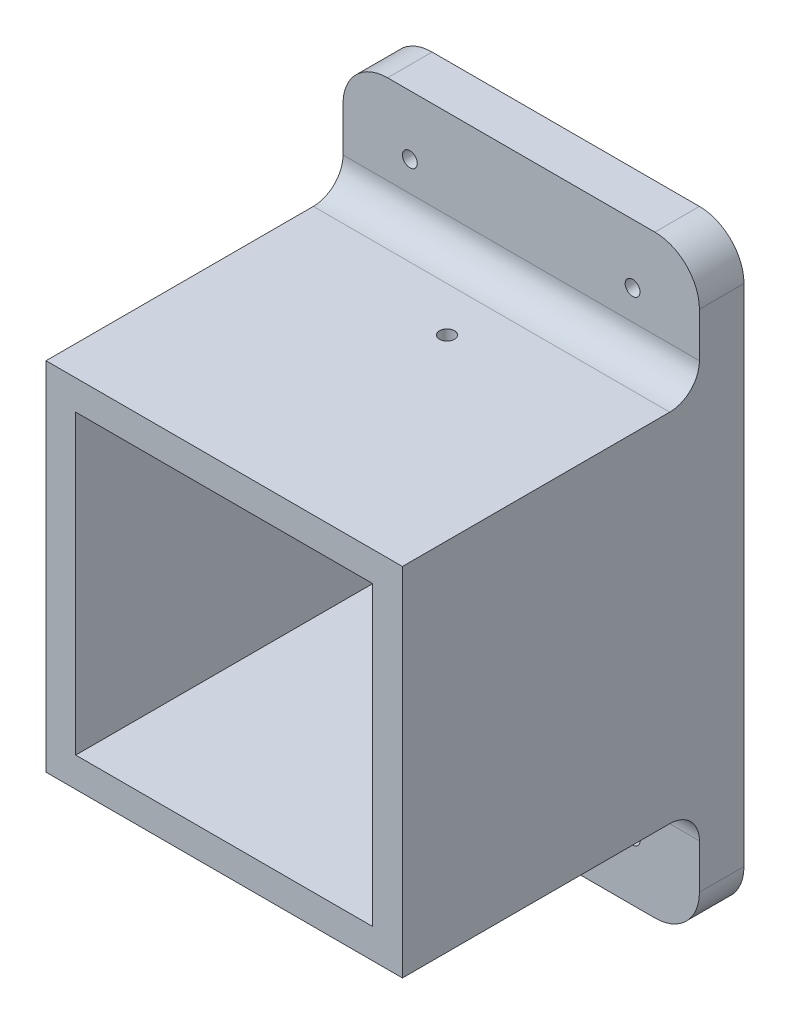
ISO-10303-21;
HEADER;
FILE_DESCRIPTION(('STEP AP214'),'2;1');
FILE_NAME('part.step','',(''),(''),'','','');
FILE_SCHEMA(('AUTOMOTIVE_DESIGN { 1 0 10303 214 1 1 1 1 }'));
ENDSEC;
DATA;
#1=APPLICATION_CONTEXT('core data for automotive mechanical design processes');
#2=APPLICATION_PROTOCOL_DEFINITION('international standard','automotive_design',2000,#1);
#3=PRODUCT_CONTEXT('',#1,'mechanical');
#4=PRODUCT('Part','Part','',(#3));
#5=PRODUCT_RELATED_PRODUCT_CATEGORY('part','',(#4));
#6=PRODUCT_DEFINITION_FORMATION('','',#4);
#7=PRODUCT_DEFINITION_CONTEXT('part definition',#1,'design');
#8=PRODUCT_DEFINITION('design','',#6,#7);
#9=PRODUCT_DEFINITION_SHAPE('','',#8);
#10=(LENGTH_UNIT() NAMED_UNIT(*) SI_UNIT(.MILLI.,.METRE.));
#11=(NAMED_UNIT(*) PLANE_ANGLE_UNIT() SI_UNIT($,.RADIAN.));
#12=(NAMED_UNIT(*) SI_UNIT($,.STERADIAN.) SOLID_ANGLE_UNIT());
#13=UNCERTAINTY_MEASURE_WITH_UNIT(LENGTH_MEASURE(1.E-05),#10,'distance_accuracy_value','');
#14=(GEOMETRIC_REPRESENTATION_CONTEXT(3) GLOBAL_UNCERTAINTY_ASSIGNED_CONTEXT((#13)) GLOBAL_UNIT_ASSIGNED_CONTEXT((#10,
#11,#12)) REPRESENTATION_CONTEXT('',''));
#15=CARTESIAN_POINT('',(0.,0.,0.));
#16=DIRECTION('',(0.,0.,1.));
#17=DIRECTION('',(1.,0.,0.));
#18=AXIS2_PLACEMENT_3D('',#15,#16,#17);
#19=CARTESIAN_POINT('',(0.,0.,100.));
#20=DIRECTION('',(0.,0.,1.));
#21=DIRECTION('',(1.,0.,0.));
#22=AXIS2_PLACEMENT_3D('',#19,#20,#21);
#23=PLANE('',#22);
#24=DIRECTION('',(1.,0.,0.));
#25=VECTOR('',#24,1.);
#26=CARTESIAN_POINT('',(-60.,-60.,100.));
#27=LINE('',#26,#25);
#28=CARTESIAN_POINT('',(-60.,-60.,100.));
#29=VERTEX_POINT('',#28);
#30=CARTESIAN_POINT('',(60.,-60.,100.));
#31=VERTEX_POINT('',#30);
#32=EDGE_CURVE('E202',#29,#31,#27,.T.);
#33=ORIENTED_EDGE('',*,*,#32,.T.);
#34=DIRECTION('',(0.,1.,0.));
#35=VECTOR('',#34,1.);
#36=CARTESIAN_POINT('',(60.,-60.,100.));
#37=LINE('',#36,#35);
#38=CARTESIAN_POINT('',(60.,60.,100.));
#39=VERTEX_POINT('',#38);
#40=EDGE_CURVE('E207',#31,#39,#37,.T.);
#41=ORIENTED_EDGE('',*,*,#40,.T.);
#42=DIRECTION('',(-1.,0.,0.));
#43=VECTOR('',#42,1.);
#44=CARTESIAN_POINT('',(-60.,60.,100.));
#45=LINE('',#44,#43);
#46=CARTESIAN_POINT('',(-60.,60.,100.));
#47=VERTEX_POINT('',#46);
#48=EDGE_CURVE('E206',#39,#47,#45,.T.);
#49=ORIENTED_EDGE('',*,*,#48,.T.);
#50=DIRECTION('',(0.,-1.,0.));
#51=VECTOR('',#50,1.);
#52=CARTESIAN_POINT('',(-60.,-60.,100.));
#53=LINE('',#52,#51);
#54=EDGE_CURVE('E208',#47,#29,#53,.T.);
#55=ORIENTED_EDGE('',*,*,#54,.T.);
#56=EDGE_LOOP('',(#33,#41,#49,#55));
#57=FACE_BOUND('',#56,.T.);
#58=DIRECTION('',(0.,1.,0.));
#59=VECTOR('',#58,1.);
#60=CARTESIAN_POINT('',(50.,-50.,100.));
#61=LINE('',#60,#59);
#62=CARTESIAN_POINT('',(50.,-50.,100.));
#63=VERTEX_POINT('',#62);
#64=CARTESIAN_POINT('',(50.,50.,100.));
#65=VERTEX_POINT('',#64);
#66=EDGE_CURVE('E193',#63,#65,#61,.T.);
#67=ORIENTED_EDGE('',*,*,#66,.F.);
#68=DIRECTION('',(1.,0.,0.));
#69=VECTOR('',#68,1.);
#70=CARTESIAN_POINT('',(-50.,-50.,100.));
#71=LINE('',#70,#69);
#72=CARTESIAN_POINT('',(-50.,-50.,100.));
#73=VERTEX_POINT('',#72);
#74=EDGE_CURVE('E191',#73,#63,#71,.T.);
#75=ORIENTED_EDGE('',*,*,#74,.F.);
#76=DIRECTION('',(0.,-1.,0.));
#77=VECTOR('',#76,1.);
#78=CARTESIAN_POINT('',(-50.,-50.,100.));
#79=LINE('',#78,#77);
#80=CARTESIAN_POINT('',(-50.,50.,100.));
#81=VERTEX_POINT('',#80);
#82=EDGE_CURVE('E173',#81,#73,#79,.T.);
#83=ORIENTED_EDGE('',*,*,#82,.F.);
#84=DIRECTION('',(-1.,0.,0.));
#85=VECTOR('',#84,1.);
#86=CARTESIAN_POINT('',(-50.,50.,100.));
#87=LINE('',#86,#85);
#88=EDGE_CURVE('E334',#65,#81,#87,.T.);
#89=ORIENTED_EDGE('',*,*,#88,.F.);
#90=EDGE_LOOP('',(#67,#75,#83,#89));
#91=FACE_BOUND('',#90,.T.);
#92=ADVANCED_FACE('F41',(#57,#91),#23,.T.);
#93=CARTESIAN_POINT('',(-60.,-60.,100.));
#94=DIRECTION('',(0.,1.,0.));
#95=DIRECTION('',(0.,0.,1.));
#96=AXIS2_PLACEMENT_3D('',#93,#94,#95);
#97=PLANE('',#96);
#98=CARTESIAN_POINT('',(0.,-60.,25.));
#99=DIRECTION('',(0.,1.,0.));
#100=DIRECTION('',(0.,0.,1.));
#101=AXIS2_PLACEMENT_3D('',#98,#99,#100);
#102=CIRCLE('',#101,2.49999999999997);
#103=CARTESIAN_POINT('',(0.,-60.,27.5));
#104=VERTEX_POINT('',#103);
#105=EDGE_CURVE('E451',#104,#104,#102,.T.);
#106=ORIENTED_EDGE('',*,*,#105,.T.);
#107=EDGE_LOOP('',(#106));
#108=FACE_BOUND('',#107,.T.);
#109=DIRECTION('',(0.,0.,-1.));
#110=VECTOR('',#109,1.);
#111=CARTESIAN_POINT('',(-60.,-60.,100.));
#112=LINE('',#111,#110);
#113=CARTESIAN_POINT('',(-60.,-60.,9.99999999999999));
#114=VERTEX_POINT('',#113);
#115=EDGE_CURVE('E211',#29,#114,#112,.T.);
#116=ORIENTED_EDGE('',*,*,#115,.T.);
#117=DIRECTION('',(1.,0.,0.));
#118=VECTOR('',#117,1.);
#119=CARTESIAN_POINT('',(60.,-60.,9.99999999999999));
#120=LINE('',#119,#118);
#121=CARTESIAN_POINT('',(60.,-60.,9.99999999999999));
#122=VERTEX_POINT('',#121);
#123=EDGE_CURVE('E286',#114,#122,#120,.T.);
#124=ORIENTED_EDGE('',*,*,#123,.T.);
#125=DIRECTION('',(0.,0.,-1.));
#126=VECTOR('',#125,1.);
#127=CARTESIAN_POINT('',(60.,-60.,100.));
#128=LINE('',#127,#126);
#129=EDGE_CURVE('E223',#31,#122,#128,.T.);
#130=ORIENTED_EDGE('',*,*,#129,.F.);
#131=ORIENTED_EDGE('',*,*,#32,.F.);
#132=EDGE_LOOP('',(#116,#124,#130,#131));
#133=FACE_BOUND('',#132,.T.);
#134=ADVANCED_FACE('F343',(#108,#133),#97,.F.);
#135=CARTESIAN_POINT('',(60.,-60.,100.));
#136=DIRECTION('',(-1.,0.,0.));
#137=DIRECTION('',(0.,-1.,0.));
#138=AXIS2_PLACEMENT_3D('',#135,#136,#137);
#139=PLANE('',#138);
#140=DIRECTION('',(0.,1.,0.));
#141=VECTOR('',#140,1.);
#142=CARTESIAN_POINT('',(60.,0.,0.));
#143=LINE('',#142,#141);
#144=CARTESIAN_POINT('',(60.,-85.,0.));
#145=VERTEX_POINT('',#144);
#146=CARTESIAN_POINT('',(60.,-70.,0.));
#147=VERTEX_POINT('',#146);
#148=EDGE_CURVE('E330',#145,#147,#143,.T.);
#149=ORIENTED_EDGE('',*,*,#148,.F.);
#150=DIRECTION('',(0.,0.,1.));
#151=VECTOR('',#150,1.);
#152=CARTESIAN_POINT('',(60.,-85.,100.));
#153=LINE('',#152,#151);
#154=CARTESIAN_POINT('',(60.,-85.,-15.));
#155=VERTEX_POINT('',#154);
#156=EDGE_CURVE('E271',#145,#155,#153,.F.);
#157=ORIENTED_EDGE('',*,*,#156,.T.);
#158=DIRECTION('',(0.,1.,0.));
#159=VECTOR('',#158,1.);
#160=CARTESIAN_POINT('',(60.,0.,-15.));
#161=LINE('',#160,#159);
#162=CARTESIAN_POINT('',(60.,85.,-15.));
#163=VERTEX_POINT('',#162);
#164=EDGE_CURVE('E190',#155,#163,#161,.T.);
#165=ORIENTED_EDGE('',*,*,#164,.T.);
#166=DIRECTION('',(0.,0.,1.));
#167=VECTOR('',#166,1.);
#168=CARTESIAN_POINT('',(60.,85.,0.));
#169=LINE('',#168,#167);
#170=CARTESIAN_POINT('',(60.,85.,0.));
#171=VERTEX_POINT('',#170);
#172=EDGE_CURVE('E266',#163,#171,#169,.T.);
#173=ORIENTED_EDGE('',*,*,#172,.T.);
#174=CARTESIAN_POINT('',(60.,70.,0.));
#175=VERTEX_POINT('',#174);
#176=EDGE_CURVE('E305',#175,#171,#143,.T.);
#177=ORIENTED_EDGE('',*,*,#176,.F.);
#178=CARTESIAN_POINT('',(60.,70.,9.99999999999999));
#179=DIRECTION('',(-1.,0.,0.));
#180=DIRECTION('',(0.,-1.,0.));
#181=AXIS2_PLACEMENT_3D('',#178,#179,#180);
#182=CIRCLE('',#181,10.);
#183=CARTESIAN_POINT('',(60.,60.,9.99999999999999));
#184=VERTEX_POINT('',#183);
#185=EDGE_CURVE('E298',#175,#184,#182,.T.);
#186=ORIENTED_EDGE('',*,*,#185,.T.);
#187=DIRECTION('',(0.,0.,-1.));
#188=VECTOR('',#187,1.);
#189=CARTESIAN_POINT('',(60.,60.,100.));
#190=LINE('',#189,#188);
#191=EDGE_CURVE('E220',#39,#184,#190,.T.);
#192=ORIENTED_EDGE('',*,*,#191,.F.);
#193=ORIENTED_EDGE('',*,*,#40,.F.);
#194=ORIENTED_EDGE('',*,*,#129,.T.);
#195=CARTESIAN_POINT('',(60.,-70.,9.99999999999999));
#196=DIRECTION('',(-1.,0.,0.));
#197=DIRECTION('',(0.,-1.,0.));
#198=AXIS2_PLACEMENT_3D('',#195,#196,#197);
#199=CIRCLE('',#198,10.);
#200=EDGE_CURVE('E47',#122,#147,#199,.T.);
#201=ORIENTED_EDGE('',*,*,#200,.T.);
#202=EDGE_LOOP('',(#149,#157,#165,#173,#177,#186,#192,#193,#194,#201));
#203=FACE_BOUND('',#202,.T.);
#204=ADVANCED_FACE('F297',(#203),#139,.F.);
#205=CARTESIAN_POINT('',(-60.,60.,100.));
#206=DIRECTION('',(0.,-1.,0.));
#207=DIRECTION('',(0.,0.,-1.));
#208=AXIS2_PLACEMENT_3D('',#205,#206,#207);
#209=PLANE('',#208);
#210=CARTESIAN_POINT('',(0.,60.,25.));
#211=DIRECTION('',(0.,1.,0.));
#212=DIRECTION('',(0.,0.,1.));
#213=AXIS2_PLACEMENT_3D('',#210,#211,#212);
#214=CIRCLE('',#213,2.525);
#215=CARTESIAN_POINT('',(0.,60.,27.525));
#216=VERTEX_POINT('',#215);
#217=EDGE_CURVE('E527',#216,#216,#214,.T.);
#218=ORIENTED_EDGE('',*,*,#217,.F.);
#219=EDGE_LOOP('',(#218));
#220=FACE_BOUND('',#219,.T.);
#221=ORIENTED_EDGE('',*,*,#191,.T.);
#222=DIRECTION('',(-1.,0.,0.));
#223=VECTOR('',#222,1.);
#224=CARTESIAN_POINT('',(-60.,60.,9.99999999999999));
#225=LINE('',#224,#223);
#226=CARTESIAN_POINT('',(-60.,60.,9.99999999999999));
#227=VERTEX_POINT('',#226);
#228=EDGE_CURVE('E283',#184,#227,#225,.T.);
#229=ORIENTED_EDGE('',*,*,#228,.T.);
#230=DIRECTION('',(0.,0.,-1.));
#231=VECTOR('',#230,1.);
#232=CARTESIAN_POINT('',(-60.,60.,100.));
#233=LINE('',#232,#231);
#234=EDGE_CURVE('E212',#47,#227,#233,.T.);
#235=ORIENTED_EDGE('',*,*,#234,.F.);
#236=ORIENTED_EDGE('',*,*,#48,.F.);
#237=EDGE_LOOP('',(#221,#229,#235,#236));
#238=FACE_BOUND('',#237,.T.);
#239=ADVANCED_FACE('F310',(#220,#238),#209,.F.);
#240=CARTESIAN_POINT('',(-60.,-60.,100.));
#241=DIRECTION('',(1.,0.,0.));
#242=DIRECTION('',(0.,1.,0.));
#243=AXIS2_PLACEMENT_3D('',#240,#241,#242);
#244=PLANE('',#243);
#245=DIRECTION('',(0.,1.,0.));
#246=VECTOR('',#245,1.);
#247=CARTESIAN_POINT('',(-60.,0.,-15.));
#248=LINE('',#247,#246);
#249=CARTESIAN_POINT('',(-60.,-85.,-15.));
#250=VERTEX_POINT('',#249);
#251=CARTESIAN_POINT('',(-60.,85.,-15.));
#252=VERTEX_POINT('',#251);
#253=EDGE_CURVE('E409',#250,#252,#248,.T.);
#254=ORIENTED_EDGE('',*,*,#253,.F.);
#255=DIRECTION('',(0.,0.,1.));
#256=VECTOR('',#255,1.);
#257=CARTESIAN_POINT('',(-60.,-85.,100.));
#258=LINE('',#257,#256);
#259=CARTESIAN_POINT('',(-60.,-85.,0.));
#260=VERTEX_POINT('',#259);
#261=EDGE_CURVE('E249',#250,#260,#258,.T.);
#262=ORIENTED_EDGE('',*,*,#261,.T.);
#263=DIRECTION('',(0.,1.,0.));
#264=VECTOR('',#263,1.);
#265=CARTESIAN_POINT('',(-60.,0.,0.));
#266=LINE('',#265,#264);
#267=CARTESIAN_POINT('',(-60.,-70.,0.));
#268=VERTEX_POINT('',#267);
#269=EDGE_CURVE('E318',#260,#268,#266,.T.);
#270=ORIENTED_EDGE('',*,*,#269,.T.);
#271=CARTESIAN_POINT('',(-60.,-70.,9.99999999999999));
#272=DIRECTION('',(1.,0.,0.));
#273=DIRECTION('',(0.,1.,0.));
#274=AXIS2_PLACEMENT_3D('',#271,#272,#273);
#275=CIRCLE('',#274,10.);
#276=EDGE_CURVE('E11',#268,#114,#275,.T.);
#277=ORIENTED_EDGE('',*,*,#276,.T.);
#278=ORIENTED_EDGE('',*,*,#115,.F.);
#279=ORIENTED_EDGE('',*,*,#54,.F.);
#280=ORIENTED_EDGE('',*,*,#234,.T.);
#281=CARTESIAN_POINT('',(-60.,70.,9.99999999999999));
#282=DIRECTION('',(1.,0.,0.));
#283=DIRECTION('',(0.,1.,0.));
#284=AXIS2_PLACEMENT_3D('',#281,#282,#283);
#285=CIRCLE('',#284,10.);
#286=CARTESIAN_POINT('',(-60.,70.,0.));
#287=VERTEX_POINT('',#286);
#288=EDGE_CURVE('E295',#227,#287,#285,.T.);
#289=ORIENTED_EDGE('',*,*,#288,.T.);
#290=CARTESIAN_POINT('',(-60.,85.,0.));
#291=VERTEX_POINT('',#290);
#292=EDGE_CURVE('E313',#287,#291,#266,.T.);
#293=ORIENTED_EDGE('',*,*,#292,.T.);
#294=DIRECTION('',(0.,0.,1.));
#295=VECTOR('',#294,1.);
#296=CARTESIAN_POINT('',(-60.,85.,-15.));
#297=LINE('',#296,#295);
#298=EDGE_CURVE('E222',#291,#252,#297,.F.);
#299=ORIENTED_EDGE('',*,*,#298,.T.);
#300=EDGE_LOOP('',(#254,#262,#270,#277,#278,#279,#280,#289,#293,#299));
#301=FACE_BOUND('',#300,.T.);
#302=ADVANCED_FACE('F312',(#301),#244,.F.);
#303=CARTESIAN_POINT('',(-50.,-50.,100.));
#304=DIRECTION('',(0.,1.,0.));
#305=DIRECTION('',(-1.,0.,0.));
#306=AXIS2_PLACEMENT_3D('',#303,#304,#305);
#307=PLANE('',#306);
#308=CARTESIAN_POINT('',(0.,-50.,25.));
#309=DIRECTION('',(0.,1.,0.));
#310=DIRECTION('',(-1.,0.,0.));
#311=AXIS2_PLACEMENT_3D('',#308,#309,#310);
#312=CIRCLE('',#311,2.49999999999997);
#313=CARTESIAN_POINT('',(-2.49999999999997,-50.,25.));
#314=VERTEX_POINT('',#313);
#315=EDGE_CURVE('E250',#314,#314,#312,.T.);
#316=ORIENTED_EDGE('',*,*,#315,.F.);
#317=EDGE_LOOP('',(#316));
#318=FACE_BOUND('',#317,.T.);
#319=DIRECTION('',(1.,0.,0.));
#320=VECTOR('',#319,1.);
#321=CARTESIAN_POINT('',(-50.,-50.,0.));
#322=LINE('',#321,#320);
#323=CARTESIAN_POINT('',(-50.,-50.,0.));
#324=VERTEX_POINT('',#323);
#325=CARTESIAN_POINT('',(50.,-50.,0.));
#326=VERTEX_POINT('',#325);
#327=EDGE_CURVE('E179',#324,#326,#322,.T.);
#328=ORIENTED_EDGE('',*,*,#327,.F.);
#329=DIRECTION('',(0.,0.,-1.));
#330=VECTOR('',#329,1.);
#331=CARTESIAN_POINT('',(-50.,-50.,100.));
#332=LINE('',#331,#330);
#333=EDGE_CURVE('E168',#73,#324,#332,.T.);
#334=ORIENTED_EDGE('',*,*,#333,.F.);
#335=ORIENTED_EDGE('',*,*,#74,.T.);
#336=DIRECTION('',(0.,0.,-1.));
#337=VECTOR('',#336,1.);
#338=CARTESIAN_POINT('',(50.,-50.,100.));
#339=LINE('',#338,#337);
#340=EDGE_CURVE('E182',#63,#326,#339,.T.);
#341=ORIENTED_EDGE('',*,*,#340,.T.);
#342=EDGE_LOOP('',(#328,#334,#335,#341));
#343=FACE_BOUND('',#342,.T.);
#344=ADVANCED_FACE('F181',(#318,#343),#307,.T.);
#345=CARTESIAN_POINT('',(50.,-50.,100.));
#346=DIRECTION('',(-1.,0.,0.));
#347=DIRECTION('',(0.,-1.,0.));
#348=AXIS2_PLACEMENT_3D('',#345,#346,#347);
#349=PLANE('',#348);
#350=DIRECTION('',(0.,1.,0.));
#351=VECTOR('',#350,1.);
#352=CARTESIAN_POINT('',(50.,-50.,0.));
#353=LINE('',#352,#351);
#354=CARTESIAN_POINT('',(50.,50.,0.));
#355=VERTEX_POINT('',#354);
#356=EDGE_CURVE('E187',#326,#355,#353,.T.);
#357=ORIENTED_EDGE('',*,*,#356,.F.);
#358=ORIENTED_EDGE('',*,*,#340,.F.);
#359=ORIENTED_EDGE('',*,*,#66,.T.);
#360=DIRECTION('',(0.,0.,-1.));
#361=VECTOR('',#360,1.);
#362=CARTESIAN_POINT('',(50.,50.,100.));
#363=LINE('',#362,#361);
#364=EDGE_CURVE('E198',#65,#355,#363,.T.);
#365=ORIENTED_EDGE('',*,*,#364,.T.);
#366=EDGE_LOOP('',(#357,#358,#359,#365));
#367=FACE_BOUND('',#366,.T.);
#368=ADVANCED_FACE('F337',(#367),#349,.T.);
#369=CARTESIAN_POINT('',(-50.,50.,100.));
#370=DIRECTION('',(0.,-1.,0.));
#371=DIRECTION('',(1.,0.,0.));
#372=AXIS2_PLACEMENT_3D('',#369,#370,#371);
#373=PLANE('',#372);
#374=CARTESIAN_POINT('',(0.,50.,25.));
#375=DIRECTION('',(0.,-1.,0.));
#376=DIRECTION('',(1.,0.,0.));
#377=AXIS2_PLACEMENT_3D('',#374,#375,#376);
#378=CIRCLE('',#377,2.49999999999997);
#379=CARTESIAN_POINT('',(2.49999999999997,50.,25.));
#380=VERTEX_POINT('',#379);
#381=EDGE_CURVE('E242',#380,#380,#378,.T.);
#382=ORIENTED_EDGE('',*,*,#381,.F.);
#383=EDGE_LOOP('',(#382));
#384=FACE_BOUND('',#383,.T.);
#385=DIRECTION('',(-1.,0.,0.));
#386=VECTOR('',#385,1.);
#387=CARTESIAN_POINT('',(-50.,50.,0.));
#388=LINE('',#387,#386);
#389=CARTESIAN_POINT('',(-50.,50.,0.));
#390=VERTEX_POINT('',#389);
#391=EDGE_CURVE('E194',#355,#390,#388,.T.);
#392=ORIENTED_EDGE('',*,*,#391,.F.);
#393=ORIENTED_EDGE('',*,*,#364,.F.);
#394=ORIENTED_EDGE('',*,*,#88,.T.);
#395=DIRECTION('',(0.,0.,-1.));
#396=VECTOR('',#395,1.);
#397=CARTESIAN_POINT('',(-50.,50.,100.));
#398=LINE('',#397,#396);
#399=EDGE_CURVE('E176',#81,#390,#398,.T.);
#400=ORIENTED_EDGE('',*,*,#399,.T.);
#401=EDGE_LOOP('',(#392,#393,#394,#400));
#402=FACE_BOUND('',#401,.T.);
#403=ADVANCED_FACE('F344',(#384,#402),#373,.T.);
#404=CARTESIAN_POINT('',(-50.,-50.,100.));
#405=DIRECTION('',(1.,0.,0.));
#406=DIRECTION('',(0.,0.,-1.));
#407=AXIS2_PLACEMENT_3D('',#404,#405,#406);
#408=PLANE('',#407);
#409=DIRECTION('',(0.,-1.,0.));
#410=VECTOR('',#409,1.);
#411=CARTESIAN_POINT('',(-50.,-50.,0.));
#412=LINE('',#411,#410);
#413=EDGE_CURVE('E167',#390,#324,#412,.T.);
#414=ORIENTED_EDGE('',*,*,#413,.F.);
#415=ORIENTED_EDGE('',*,*,#399,.F.);
#416=ORIENTED_EDGE('',*,*,#82,.T.);
#417=ORIENTED_EDGE('',*,*,#333,.T.);
#418=EDGE_LOOP('',(#414,#415,#416,#417));
#419=FACE_BOUND('',#418,.T.);
#420=ADVANCED_FACE('F166',(#419),#408,.T.);
#421=CARTESIAN_POINT('',(0.,0.,0.));
#422=DIRECTION('',(0.,0.,-1.));
#423=DIRECTION('',(-1.,0.,0.));
#424=AXIS2_PLACEMENT_3D('',#421,#422,#423);
#425=PLANE('',#424);
#426=ORIENTED_EDGE('',*,*,#413,.T.);
#427=ORIENTED_EDGE('',*,*,#327,.T.);
#428=ORIENTED_EDGE('',*,*,#356,.T.);
#429=ORIENTED_EDGE('',*,*,#391,.T.);
#430=EDGE_LOOP('',(#426,#427,#428,#429));
#431=FACE_BOUND('',#430,.T.);
#432=ADVANCED_FACE('F186',(#431),#425,.F.);
#433=CARTESIAN_POINT('',(-37.5,-80.,0.));
#434=DIRECTION('',(0.,0.,-1.));
#435=DIRECTION('',(-1.,0.,0.));
#436=AXIS2_PLACEMENT_3D('',#433,#434,#435);
#437=CIRCLE('',#436,2.49999999999998);
#438=CARTESIAN_POINT('',(-40.,-80.,0.));
#439=VERTEX_POINT('',#438);
#440=EDGE_CURVE('E237',#439,#439,#437,.T.);
#441=ORIENTED_EDGE('',*,*,#440,.T.);
#442=EDGE_LOOP('',(#441));
#443=FACE_BOUND('',#442,.T.);
#444=CARTESIAN_POINT('',(37.5,-80.,0.));
#445=DIRECTION('',(0.,0.,-1.));
#446=DIRECTION('',(-1.,0.,0.));
#447=AXIS2_PLACEMENT_3D('',#444,#445,#446);
#448=CIRCLE('',#447,2.49999999999998);
#449=CARTESIAN_POINT('',(35.,-80.,0.));
#450=VERTEX_POINT('',#449);
#451=EDGE_CURVE('E234',#450,#450,#448,.T.);
#452=ORIENTED_EDGE('',*,*,#451,.T.);
#453=EDGE_LOOP('',(#452));
#454=FACE_BOUND('',#453,.T.);
#455=ORIENTED_EDGE('',*,*,#148,.T.);
#456=DIRECTION('',(1.,0.,0.));
#457=VECTOR('',#456,1.);
#458=CARTESIAN_POINT('',(-60.,-70.,0.));
#459=LINE('',#458,#457);
#460=EDGE_CURVE('E61',#147,#268,#459,.F.);
#461=ORIENTED_EDGE('',*,*,#460,.T.);
#462=ORIENTED_EDGE('',*,*,#269,.F.);
#463=CARTESIAN_POINT('',(-45.,-85.,0.));
#464=DIRECTION('',(0.,0.,-1.));
#465=DIRECTION('',(-1.,0.,0.));
#466=AXIS2_PLACEMENT_3D('',#463,#464,#465);
#467=CIRCLE('',#466,15.);
#468=CARTESIAN_POINT('',(-45.,-100.,0.));
#469=VERTEX_POINT('',#468);
#470=EDGE_CURVE('E253',#260,#469,#467,.F.);
#471=ORIENTED_EDGE('',*,*,#470,.T.);
#472=DIRECTION('',(-1.,0.,0.));
#473=VECTOR('',#472,1.);
#474=CARTESIAN_POINT('',(0.,-100.,0.));
#475=LINE('',#474,#473);
#476=CARTESIAN_POINT('',(45.,-100.,0.));
#477=VERTEX_POINT('',#476);
#478=EDGE_CURVE('E227',#477,#469,#475,.T.);
#479=ORIENTED_EDGE('',*,*,#478,.F.);
#480=CARTESIAN_POINT('',(45.,-85.,0.));
#481=DIRECTION('',(0.,0.,-1.));
#482=DIRECTION('',(-1.,0.,0.));
#483=AXIS2_PLACEMENT_3D('',#480,#481,#482);
#484=CIRCLE('',#483,15.);
#485=EDGE_CURVE('E254',#477,#145,#484,.F.);
#486=ORIENTED_EDGE('',*,*,#485,.T.);
#487=EDGE_LOOP('',(#455,#461,#462,#471,#479,#486));
#488=FACE_BOUND('',#487,.T.);
#489=ADVANCED_FACE('F391',(#443,#454,#488),#425,.F.);
#490=CARTESIAN_POINT('',(0.,-100.,-15.));
#491=DIRECTION('',(0.,1.,0.));
#492=DIRECTION('',(-1.,0.,0.));
#493=AXIS2_PLACEMENT_3D('',#490,#491,#492);
#494=PLANE('',#493);
#495=ORIENTED_EDGE('',*,*,#478,.T.);
#496=DIRECTION('',(0.,0.,1.));
#497=VECTOR('',#496,1.);
#498=CARTESIAN_POINT('',(-45.,-100.,-15.));
#499=LINE('',#498,#497);
#500=CARTESIAN_POINT('',(-45.,-100.,-15.));
#501=VERTEX_POINT('',#500);
#502=EDGE_CURVE('E257',#469,#501,#499,.F.);
#503=ORIENTED_EDGE('',*,*,#502,.T.);
#504=DIRECTION('',(-1.,0.,0.));
#505=VECTOR('',#504,1.);
#506=CARTESIAN_POINT('',(0.,-100.,-15.));
#507=LINE('',#506,#505);
#508=CARTESIAN_POINT('',(45.,-100.,-15.));
#509=VERTEX_POINT('',#508);
#510=EDGE_CURVE('E326',#509,#501,#507,.T.);
#511=ORIENTED_EDGE('',*,*,#510,.F.);
#512=DIRECTION('',(0.,0.,1.));
#513=VECTOR('',#512,1.);
#514=CARTESIAN_POINT('',(45.,-100.,-15.));
#515=LINE('',#514,#513);
#516=EDGE_CURVE('E256',#509,#477,#515,.T.);
#517=ORIENTED_EDGE('',*,*,#516,.T.);
#518=EDGE_LOOP('',(#495,#503,#511,#517));
#519=FACE_BOUND('',#518,.T.);
#520=ADVANCED_FACE('F397',(#519),#494,.F.);
#521=CARTESIAN_POINT('',(0.,100.,-15.));
#522=DIRECTION('',(0.,1.,0.));
#523=DIRECTION('',(0.,0.,1.));
#524=AXIS2_PLACEMENT_3D('',#521,#522,#523);
#525=PLANE('',#524);
#526=DIRECTION('',(-1.,0.,0.));
#527=VECTOR('',#526,1.);
#528=CARTESIAN_POINT('',(0.,100.,-15.));
#529=LINE('',#528,#527);
#530=CARTESIAN_POINT('',(45.,100.,-15.));
#531=VERTEX_POINT('',#530);
#532=CARTESIAN_POINT('',(-45.,100.,-15.));
#533=VERTEX_POINT('',#532);
#534=EDGE_CURVE('E410',#531,#533,#529,.T.);
#535=ORIENTED_EDGE('',*,*,#534,.T.);
#536=DIRECTION('',(0.,0.,1.));
#537=VECTOR('',#536,1.);
#538=CARTESIAN_POINT('',(-45.,100.,0.));
#539=LINE('',#538,#537);
#540=CARTESIAN_POINT('',(-45.,100.,0.));
#541=VERTEX_POINT('',#540);
#542=EDGE_CURVE('E276',#533,#541,#539,.T.);
#543=ORIENTED_EDGE('',*,*,#542,.T.);
#544=DIRECTION('',(-1.,0.,0.));
#545=VECTOR('',#544,1.);
#546=CARTESIAN_POINT('',(0.,100.,0.));
#547=LINE('',#546,#545);
#548=CARTESIAN_POINT('',(45.,100.,0.));
#549=VERTEX_POINT('',#548);
#550=EDGE_CURVE('E321',#549,#541,#547,.T.);
#551=ORIENTED_EDGE('',*,*,#550,.F.);
#552=DIRECTION('',(0.,0.,1.));
#553=VECTOR('',#552,1.);
#554=CARTESIAN_POINT('',(45.,100.,-15.));
#555=LINE('',#554,#553);
#556=EDGE_CURVE('E273',#549,#531,#555,.F.);
#557=ORIENTED_EDGE('',*,*,#556,.T.);
#558=EDGE_LOOP('',(#535,#543,#551,#557));
#559=FACE_BOUND('',#558,.T.);
#560=ADVANCED_FACE('F425',(#559),#525,.T.);
#561=CARTESIAN_POINT('',(0.,0.,-15.));
#562=DIRECTION('',(0.,0.,-1.));
#563=DIRECTION('',(-1.,0.,0.));
#564=AXIS2_PLACEMENT_3D('',#561,#562,#563);
#565=PLANE('',#564);
#566=CARTESIAN_POINT('',(-37.5,-80.,-15.));
#567=DIRECTION('',(0.,0.,-1.));
#568=DIRECTION('',(-1.,0.,0.));
#569=AXIS2_PLACEMENT_3D('',#566,#567,#568);
#570=CIRCLE('',#569,2.525);
#571=CARTESIAN_POINT('',(-40.025,-80.,-15.));
#572=VERTEX_POINT('',#571);
#573=EDGE_CURVE('E452',#572,#572,#570,.T.);
#574=ORIENTED_EDGE('',*,*,#573,.F.);
#575=EDGE_LOOP('',(#574));
#576=FACE_BOUND('',#575,.T.);
#577=CARTESIAN_POINT('',(37.5,-80.,-15.));
#578=DIRECTION('',(0.,0.,-1.));
#579=DIRECTION('',(-1.,0.,0.));
#580=AXIS2_PLACEMENT_3D('',#577,#578,#579);
#581=CIRCLE('',#580,2.525);
#582=CARTESIAN_POINT('',(34.975,-80.,-15.));
#583=VERTEX_POINT('',#582);
#584=EDGE_CURVE('E245',#583,#583,#581,.T.);
#585=ORIENTED_EDGE('',*,*,#584,.F.);
#586=EDGE_LOOP('',(#585));
#587=FACE_BOUND('',#586,.T.);
#588=CARTESIAN_POINT('',(-37.5,80.,-15.));
#589=DIRECTION('',(0.,0.,-1.));
#590=DIRECTION('',(-1.,0.,0.));
#591=AXIS2_PLACEMENT_3D('',#588,#589,#590);
#592=CIRCLE('',#591,2.525);
#593=CARTESIAN_POINT('',(-40.025,80.,-15.));
#594=VERTEX_POINT('',#593);
#595=EDGE_CURVE('E240',#594,#594,#592,.T.);
#596=ORIENTED_EDGE('',*,*,#595,.F.);
#597=EDGE_LOOP('',(#596));
#598=FACE_BOUND('',#597,.T.);
#599=CARTESIAN_POINT('',(37.5,80.,-15.));
#600=DIRECTION('',(0.,0.,-1.));
#601=DIRECTION('',(-1.,0.,0.));
#602=AXIS2_PLACEMENT_3D('',#599,#600,#601);
#603=CIRCLE('',#602,2.525);
#604=CARTESIAN_POINT('',(34.975,80.,-15.));
#605=VERTEX_POINT('',#604);
#606=EDGE_CURVE('E235',#605,#605,#603,.T.);
#607=ORIENTED_EDGE('',*,*,#606,.F.);
#608=EDGE_LOOP('',(#607));
#609=FACE_BOUND('',#608,.T.);
#610=ORIENTED_EDGE('',*,*,#510,.T.);
#611=CARTESIAN_POINT('',(-45.,-85.,-15.));
#612=DIRECTION('',(0.,0.,-1.));
#613=DIRECTION('',(-1.,0.,0.));
#614=AXIS2_PLACEMENT_3D('',#611,#612,#613);
#615=CIRCLE('',#614,15.);
#616=EDGE_CURVE('E267',#501,#250,#615,.T.);
#617=ORIENTED_EDGE('',*,*,#616,.T.);
#618=ORIENTED_EDGE('',*,*,#253,.T.);
#619=CARTESIAN_POINT('',(-45.,85.,-15.));
#620=DIRECTION('',(0.,0.,-1.));
#621=DIRECTION('',(-1.,0.,0.));
#622=AXIS2_PLACEMENT_3D('',#619,#620,#621);
#623=CIRCLE('',#622,15.);
#624=EDGE_CURVE('E261',#252,#533,#623,.T.);
#625=ORIENTED_EDGE('',*,*,#624,.T.);
#626=ORIENTED_EDGE('',*,*,#534,.F.);
#627=CARTESIAN_POINT('',(45.,85.,-15.));
#628=DIRECTION('',(0.,0.,-1.));
#629=DIRECTION('',(-1.,0.,0.));
#630=AXIS2_PLACEMENT_3D('',#627,#628,#629);
#631=CIRCLE('',#630,15.);
#632=EDGE_CURVE('E264',#531,#163,#631,.T.);
#633=ORIENTED_EDGE('',*,*,#632,.T.);
#634=ORIENTED_EDGE('',*,*,#164,.F.);
#635=CARTESIAN_POINT('',(45.,-85.,-15.));
#636=DIRECTION('',(0.,0.,-1.));
#637=DIRECTION('',(-1.,0.,0.));
#638=AXIS2_PLACEMENT_3D('',#635,#636,#637);
#639=CIRCLE('',#638,15.);
#640=EDGE_CURVE('E268',#155,#509,#639,.T.);
#641=ORIENTED_EDGE('',*,*,#640,.T.);
#642=EDGE_LOOP('',(#610,#617,#618,#625,#626,#633,#634,#641));
#643=FACE_BOUND('',#642,.T.);
#644=ADVANCED_FACE('F403',(#576,#587,#598,#609,#643),#565,.T.);
#645=CARTESIAN_POINT('',(-37.5,80.,0.));
#646=DIRECTION('',(0.,0.,-1.));
#647=DIRECTION('',(-1.,0.,0.));
#648=AXIS2_PLACEMENT_3D('',#645,#646,#647);
#649=CIRCLE('',#648,2.49999999999998);
#650=CARTESIAN_POINT('',(-40.,80.,0.));
#651=VERTEX_POINT('',#650);
#652=EDGE_CURVE('E230',#651,#651,#649,.T.);
#653=ORIENTED_EDGE('',*,*,#652,.T.);
#654=EDGE_LOOP('',(#653));
#655=FACE_BOUND('',#654,.T.);
#656=CARTESIAN_POINT('',(37.5,80.,0.));
#657=DIRECTION('',(0.,0.,-1.));
#658=DIRECTION('',(-1.,0.,0.));
#659=AXIS2_PLACEMENT_3D('',#656,#657,#658);
#660=CIRCLE('',#659,2.49999999999998);
#661=CARTESIAN_POINT('',(35.,80.,0.));
#662=VERTEX_POINT('',#661);
#663=EDGE_CURVE('E225',#662,#662,#660,.T.);
#664=ORIENTED_EDGE('',*,*,#663,.T.);
#665=EDGE_LOOP('',(#664));
#666=FACE_BOUND('',#665,.T.);
#667=ORIENTED_EDGE('',*,*,#292,.F.);
#668=DIRECTION('',(-1.,0.,0.));
#669=VECTOR('',#668,1.);
#670=CARTESIAN_POINT('',(60.,70.,0.));
#671=LINE('',#670,#669);
#672=EDGE_CURVE('E287',#287,#175,#671,.F.);
#673=ORIENTED_EDGE('',*,*,#672,.T.);
#674=ORIENTED_EDGE('',*,*,#176,.T.);
#675=CARTESIAN_POINT('',(45.,85.,0.));
#676=DIRECTION('',(0.,0.,-1.));
#677=DIRECTION('',(-1.,0.,0.));
#678=AXIS2_PLACEMENT_3D('',#675,#676,#677);
#679=CIRCLE('',#678,15.);
#680=EDGE_CURVE('E277',#171,#549,#679,.F.);
#681=ORIENTED_EDGE('',*,*,#680,.T.);
#682=ORIENTED_EDGE('',*,*,#550,.T.);
#683=CARTESIAN_POINT('',(-45.,85.,0.));
#684=DIRECTION('',(0.,0.,-1.));
#685=DIRECTION('',(-1.,0.,0.));
#686=AXIS2_PLACEMENT_3D('',#683,#684,#685);
#687=CIRCLE('',#686,15.);
#688=EDGE_CURVE('E284',#541,#291,#687,.F.);
#689=ORIENTED_EDGE('',*,*,#688,.T.);
#690=EDGE_LOOP('',(#667,#673,#674,#681,#682,#689));
#691=FACE_BOUND('',#690,.T.);
#692=ADVANCED_FACE('F320',(#655,#666,#691),#425,.F.);
#693=CARTESIAN_POINT('',(37.5,80.,-15.));
#694=DIRECTION('',(0.,0.,-1.));
#695=DIRECTION('',(-1.,0.,0.));
#696=AXIS2_PLACEMENT_3D('',#693,#694,#695);
#697=CYLINDRICAL_SURFACE('',#696,2.49999999999998);
#698=CARTESIAN_POINT('',(37.5,80.,-14.975));
#699=DIRECTION('',(0.,0.,-1.));
#700=DIRECTION('',(-1.,0.,0.));
#701=AXIS2_PLACEMENT_3D('',#698,#699,#700);
#702=CIRCLE('',#701,2.49999999999999);
#703=CARTESIAN_POINT('',(35.,80.,-14.975));
#704=VERTEX_POINT('',#703);
#705=EDGE_CURVE('E226',#704,#704,#702,.T.);
#706=ORIENTED_EDGE('',*,*,#705,.T.);
#707=EDGE_LOOP('',(#706));
#708=FACE_BOUND('',#707,.T.);
#709=ORIENTED_EDGE('',*,*,#663,.F.);
#710=EDGE_LOOP('',(#709));
#711=FACE_BOUND('',#710,.T.);
#712=ADVANCED_FACE('F477',(#708,#711),#697,.F.);
#713=CARTESIAN_POINT('',(37.5,80.,-15.));
#714=DIRECTION('',(0.,0.,-1.));
#715=DIRECTION('',(-1.,0.,0.));
#716=AXIS2_PLACEMENT_3D('',#713,#714,#715);
#717=CONICAL_SURFACE('',#716,2.525,0.785398163397448);
#718=ORIENTED_EDGE('',*,*,#705,.F.);
#719=EDGE_LOOP('',(#718));
#720=FACE_BOUND('',#719,.T.);
#721=ORIENTED_EDGE('',*,*,#606,.T.);
#722=EDGE_LOOP('',(#721));
#723=FACE_BOUND('',#722,.T.);
#724=ADVANCED_FACE('F476',(#720,#723),#717,.F.);
#725=CARTESIAN_POINT('',(-37.5,80.,-15.));
#726=DIRECTION('',(0.,0.,-1.));
#727=DIRECTION('',(-1.,0.,0.));
#728=AXIS2_PLACEMENT_3D('',#725,#726,#727);
#729=CYLINDRICAL_SURFACE('',#728,2.49999999999998);
#730=CARTESIAN_POINT('',(-37.5,80.,-14.975));
#731=DIRECTION('',(0.,0.,-1.));
#732=DIRECTION('',(-1.,0.,0.));
#733=AXIS2_PLACEMENT_3D('',#730,#731,#732);
#734=CIRCLE('',#733,2.49999999999999);
#735=CARTESIAN_POINT('',(-40.,80.,-14.975));
#736=VERTEX_POINT('',#735);
#737=EDGE_CURVE('E231',#736,#736,#734,.T.);
#738=ORIENTED_EDGE('',*,*,#737,.T.);
#739=EDGE_LOOP('',(#738));
#740=FACE_BOUND('',#739,.T.);
#741=ORIENTED_EDGE('',*,*,#652,.F.);
#742=EDGE_LOOP('',(#741));
#743=FACE_BOUND('',#742,.T.);
#744=ADVANCED_FACE('F484',(#740,#743),#729,.F.);
#745=CARTESIAN_POINT('',(-37.5,80.,-15.));
#746=DIRECTION('',(0.,0.,-1.));
#747=DIRECTION('',(-1.,0.,0.));
#748=AXIS2_PLACEMENT_3D('',#745,#746,#747);
#749=CONICAL_SURFACE('',#748,2.525,0.785398163397448);
#750=ORIENTED_EDGE('',*,*,#737,.F.);
#751=EDGE_LOOP('',(#750));
#752=FACE_BOUND('',#751,.T.);
#753=ORIENTED_EDGE('',*,*,#595,.T.);
#754=EDGE_LOOP('',(#753));
#755=FACE_BOUND('',#754,.T.);
#756=ADVANCED_FACE('F489',(#752,#755),#749,.F.);
#757=CARTESIAN_POINT('',(37.5,-80.,-15.));
#758=DIRECTION('',(0.,0.,-1.));
#759=DIRECTION('',(-1.,0.,0.));
#760=AXIS2_PLACEMENT_3D('',#757,#758,#759);
#761=CYLINDRICAL_SURFACE('',#760,2.49999999999998);
#762=CARTESIAN_POINT('',(37.5,-80.,-14.975));
#763=DIRECTION('',(0.,0.,-1.));
#764=DIRECTION('',(-1.,0.,0.));
#765=AXIS2_PLACEMENT_3D('',#762,#763,#764);
#766=CIRCLE('',#765,2.49999999999999);
#767=CARTESIAN_POINT('',(35.,-80.,-14.975));
#768=VERTEX_POINT('',#767);
#769=EDGE_CURVE('E238',#768,#768,#766,.T.);
#770=ORIENTED_EDGE('',*,*,#769,.T.);
#771=EDGE_LOOP('',(#770));
#772=FACE_BOUND('',#771,.T.);
#773=ORIENTED_EDGE('',*,*,#451,.F.);
#774=EDGE_LOOP('',(#773));
#775=FACE_BOUND('',#774,.T.);
#776=ADVANCED_FACE('F500',(#772,#775),#761,.F.);
#777=CARTESIAN_POINT('',(37.5,-80.,-15.));
#778=DIRECTION('',(0.,0.,-1.));
#779=DIRECTION('',(-1.,0.,0.));
#780=AXIS2_PLACEMENT_3D('',#777,#778,#779);
#781=CONICAL_SURFACE('',#780,2.525,0.785398163397448);
#782=ORIENTED_EDGE('',*,*,#769,.F.);
#783=EDGE_LOOP('',(#782));
#784=FACE_BOUND('',#783,.T.);
#785=ORIENTED_EDGE('',*,*,#584,.T.);
#786=EDGE_LOOP('',(#785));
#787=FACE_BOUND('',#786,.T.);
#788=ADVANCED_FACE('F501',(#784,#787),#781,.F.);
#789=CARTESIAN_POINT('',(-37.5,-80.,-15.));
#790=DIRECTION('',(0.,0.,-1.));
#791=DIRECTION('',(-1.,0.,0.));
#792=AXIS2_PLACEMENT_3D('',#789,#790,#791);
#793=CYLINDRICAL_SURFACE('',#792,2.49999999999998);
#794=CARTESIAN_POINT('',(-37.5,-80.,-14.975));
#795=DIRECTION('',(0.,0.,-1.));
#796=DIRECTION('',(-1.,0.,0.));
#797=AXIS2_PLACEMENT_3D('',#794,#795,#796);
#798=CIRCLE('',#797,2.49999999999999);
#799=CARTESIAN_POINT('',(-40.,-80.,-14.975));
#800=VERTEX_POINT('',#799);
#801=EDGE_CURVE('E243',#800,#800,#798,.T.);
#802=ORIENTED_EDGE('',*,*,#801,.T.);
#803=EDGE_LOOP('',(#802));
#804=FACE_BOUND('',#803,.T.);
#805=ORIENTED_EDGE('',*,*,#440,.F.);
#806=EDGE_LOOP('',(#805));
#807=FACE_BOUND('',#806,.T.);
#808=ADVANCED_FACE('F504',(#804,#807),#793,.F.);
#809=CARTESIAN_POINT('',(-37.5,-80.,-15.));
#810=DIRECTION('',(0.,0.,-1.));
#811=DIRECTION('',(-1.,0.,0.));
#812=AXIS2_PLACEMENT_3D('',#809,#810,#811);
#813=CONICAL_SURFACE('',#812,2.525,0.785398163397448);
#814=ORIENTED_EDGE('',*,*,#801,.F.);
#815=EDGE_LOOP('',(#814));
#816=FACE_BOUND('',#815,.T.);
#817=ORIENTED_EDGE('',*,*,#573,.T.);
#818=EDGE_LOOP('',(#817));
#819=FACE_BOUND('',#818,.T.);
#820=ADVANCED_FACE('F508',(#816,#819),#813,.F.);
#821=CARTESIAN_POINT('',(0.,60.,25.));
#822=DIRECTION('',(0.,1.,0.));
#823=DIRECTION('',(0.,0.,1.));
#824=AXIS2_PLACEMENT_3D('',#821,#822,#823);
#825=CYLINDRICAL_SURFACE('',#824,2.49999999999997);
#826=ORIENTED_EDGE('',*,*,#381,.T.);
#827=EDGE_LOOP('',(#826));
#828=FACE_BOUND('',#827,.T.);
#829=CARTESIAN_POINT('',(0.,59.975,25.));
#830=DIRECTION('',(0.,1.,0.));
#831=DIRECTION('',(0.,0.,1.));
#832=AXIS2_PLACEMENT_3D('',#829,#830,#831);
#833=CIRCLE('',#832,2.49999999999998);
#834=CARTESIAN_POINT('',(0.,59.975,27.5));
#835=VERTEX_POINT('',#834);
#836=EDGE_CURVE('E247',#835,#835,#833,.T.);
#837=ORIENTED_EDGE('',*,*,#836,.T.);
#838=EDGE_LOOP('',(#837));
#839=FACE_BOUND('',#838,.T.);
#840=ADVANCED_FACE('F515',(#828,#839),#825,.F.);
#841=CARTESIAN_POINT('',(0.,60.,25.));
#842=DIRECTION('',(0.,1.,0.));
#843=DIRECTION('',(0.,0.,1.));
#844=AXIS2_PLACEMENT_3D('',#841,#842,#843);
#845=CONICAL_SURFACE('',#844,2.525,0.785398163397336);
#846=ORIENTED_EDGE('',*,*,#836,.F.);
#847=EDGE_LOOP('',(#846));
#848=FACE_BOUND('',#847,.T.);
#849=ORIENTED_EDGE('',*,*,#217,.T.);
#850=EDGE_LOOP('',(#849));
#851=FACE_BOUND('',#850,.T.);
#852=ADVANCED_FACE('F519',(#848,#851),#845,.F.);
#853=ORIENTED_EDGE('',*,*,#315,.T.);
#854=EDGE_LOOP('',(#853));
#855=FACE_BOUND('',#854,.T.);
#856=ORIENTED_EDGE('',*,*,#105,.F.);
#857=EDGE_LOOP('',(#856));
#858=FACE_BOUND('',#857,.T.);
#859=ADVANCED_FACE('F370',(#855,#858),#825,.F.);
#860=CARTESIAN_POINT('',(-45.,-85.,100.));
#861=DIRECTION('',(0.,0.,1.));
#862=DIRECTION('',(1.,0.,0.));
#863=AXIS2_PLACEMENT_3D('',#860,#861,#862);
#864=CYLINDRICAL_SURFACE('',#863,15.);
#865=ORIENTED_EDGE('',*,*,#616,.F.);
#866=ORIENTED_EDGE('',*,*,#502,.F.);
#867=ORIENTED_EDGE('',*,*,#470,.F.);
#868=ORIENTED_EDGE('',*,*,#261,.F.);
#869=EDGE_LOOP('',(#865,#866,#867,#868));
#870=FACE_BOUND('',#869,.T.);
#871=ADVANCED_FACE('F361',(#870),#864,.T.);
#872=CARTESIAN_POINT('',(45.,-85.,-15.));
#873=DIRECTION('',(0.,0.,1.));
#874=DIRECTION('',(1.,0.,0.));
#875=AXIS2_PLACEMENT_3D('',#872,#873,#874);
#876=CYLINDRICAL_SURFACE('',#875,15.);
#877=ORIENTED_EDGE('',*,*,#640,.F.);
#878=ORIENTED_EDGE('',*,*,#156,.F.);
#879=ORIENTED_EDGE('',*,*,#485,.F.);
#880=ORIENTED_EDGE('',*,*,#516,.F.);
#881=EDGE_LOOP('',(#877,#878,#879,#880));
#882=FACE_BOUND('',#881,.T.);
#883=ADVANCED_FACE('F366',(#882),#876,.T.);
#884=CARTESIAN_POINT('',(-45.,85.,-15.));
#885=DIRECTION('',(0.,0.,-1.));
#886=DIRECTION('',(-1.,0.,0.));
#887=AXIS2_PLACEMENT_3D('',#884,#885,#886);
#888=CYLINDRICAL_SURFACE('',#887,15.);
#889=ORIENTED_EDGE('',*,*,#624,.F.);
#890=ORIENTED_EDGE('',*,*,#298,.F.);
#891=ORIENTED_EDGE('',*,*,#688,.F.);
#892=ORIENTED_EDGE('',*,*,#542,.F.);
#893=EDGE_LOOP('',(#889,#890,#891,#892));
#894=FACE_BOUND('',#893,.T.);
#895=ADVANCED_FACE('F371',(#894),#888,.T.);
#896=CARTESIAN_POINT('',(45.,85.,100.));
#897=DIRECTION('',(0.,0.,-1.));
#898=DIRECTION('',(-1.,0.,0.));
#899=AXIS2_PLACEMENT_3D('',#896,#897,#898);
#900=CYLINDRICAL_SURFACE('',#899,15.);
#901=ORIENTED_EDGE('',*,*,#632,.F.);
#902=ORIENTED_EDGE('',*,*,#556,.F.);
#903=ORIENTED_EDGE('',*,*,#680,.F.);
#904=ORIENTED_EDGE('',*,*,#172,.F.);
#905=EDGE_LOOP('',(#901,#902,#903,#904));
#906=FACE_BOUND('',#905,.T.);
#907=ADVANCED_FACE('F374',(#906),#900,.T.);
#908=CARTESIAN_POINT('',(-60.,70.,9.99999999999999));
#909=DIRECTION('',(1.,0.,0.));
#910=DIRECTION('',(0.,0.,-1.));
#911=AXIS2_PLACEMENT_3D('',#908,#909,#910);
#912=CYLINDRICAL_SURFACE('',#911,10.);
#913=ORIENTED_EDGE('',*,*,#185,.F.);
#914=ORIENTED_EDGE('',*,*,#672,.F.);
#915=ORIENTED_EDGE('',*,*,#288,.F.);
#916=ORIENTED_EDGE('',*,*,#228,.F.);
#917=EDGE_LOOP('',(#913,#914,#915,#916));
#918=FACE_BOUND('',#917,.T.);
#919=ADVANCED_FACE('F307',(#918),#912,.F.);
#920=CARTESIAN_POINT('',(-60.,-70.,9.99999999999999));
#921=DIRECTION('',(-1.,0.,0.));
#922=DIRECTION('',(0.,0.,1.));
#923=AXIS2_PLACEMENT_3D('',#920,#921,#922);
#924=CYLINDRICAL_SURFACE('',#923,10.);
#925=ORIENTED_EDGE('',*,*,#276,.F.);
#926=ORIENTED_EDGE('',*,*,#460,.F.);
#927=ORIENTED_EDGE('',*,*,#200,.F.);
#928=ORIENTED_EDGE('',*,*,#123,.F.);
#929=EDGE_LOOP('',(#925,#926,#927,#928));
#930=FACE_BOUND('',#929,.T.);
#931=ADVANCED_FACE('F43',(#930),#924,.F.);
#932=CLOSED_SHELL('',(#92,#134,#204,#239,#302,#344,#368,#403,#420,#432,#489,#520,#560,#644,#692,
#712,#724,#744,#756,#776,#788,#808,#820,#840,#852,#859,#871,#883,#895,#907,#919,#931));
#933=MANIFOLD_SOLID_BREP('B2',#932);
#934=ADVANCED_BREP_SHAPE_REPRESENTATION('',(#18,#933),#14);
#935=SHAPE_DEFINITION_REPRESENTATION(#9,#934);
ENDSEC;
END-ISO-10303-21;
